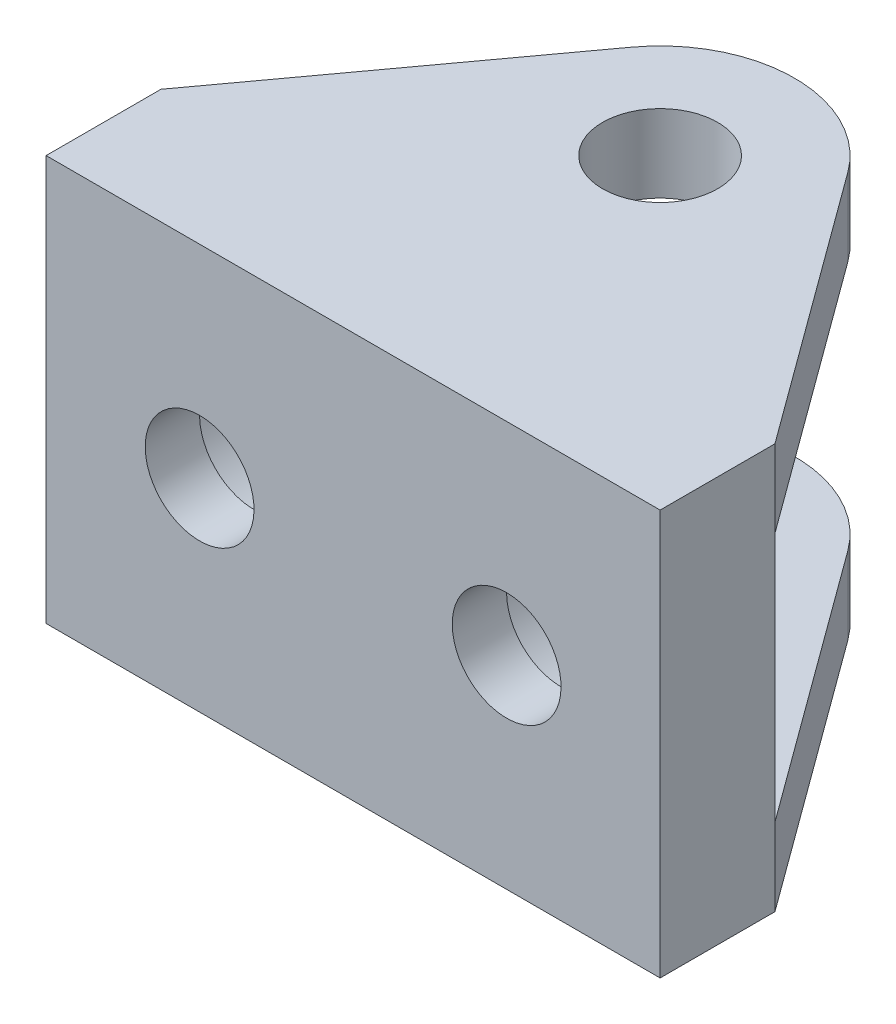
ISO-10303-21;
HEADER;
FILE_DESCRIPTION(('STEP AP214'),'2;1');
FILE_NAME('part.step','',(''),(''),'','','');
FILE_SCHEMA(('AUTOMOTIVE_DESIGN { 1 0 10303 214 1 1 1 1 }'));
ENDSEC;
DATA;
#1=APPLICATION_CONTEXT('core data for automotive mechanical design processes');
#2=APPLICATION_PROTOCOL_DEFINITION('international standard','automotive_design',2000,#1);
#3=PRODUCT_CONTEXT('',#1,'mechanical');
#4=PRODUCT('Part','Part','',(#3));
#5=PRODUCT_RELATED_PRODUCT_CATEGORY('part','',(#4));
#6=PRODUCT_DEFINITION_FORMATION('','',#4);
#7=PRODUCT_DEFINITION_CONTEXT('part definition',#1,'design');
#8=PRODUCT_DEFINITION('design','',#6,#7);
#9=PRODUCT_DEFINITION_SHAPE('','',#8);
#10=(LENGTH_UNIT() NAMED_UNIT(*) SI_UNIT(.MILLI.,.METRE.));
#11=(NAMED_UNIT(*) PLANE_ANGLE_UNIT() SI_UNIT($,.RADIAN.));
#12=(NAMED_UNIT(*) SI_UNIT($,.STERADIAN.) SOLID_ANGLE_UNIT());
#13=UNCERTAINTY_MEASURE_WITH_UNIT(LENGTH_MEASURE(1.E-05),#10,'distance_accuracy_value','');
#14=(GEOMETRIC_REPRESENTATION_CONTEXT(3) GLOBAL_UNCERTAINTY_ASSIGNED_CONTEXT((#13)) GLOBAL_UNIT_ASSIGNED_CONTEXT((#10,
#11,#12)) REPRESENTATION_CONTEXT('',''));
#15=CARTESIAN_POINT('',(0.,0.,0.));
#16=DIRECTION('',(0.,0.,1.));
#17=DIRECTION('',(1.,0.,0.));
#18=AXIS2_PLACEMENT_3D('',#15,#16,#17);
#19=CARTESIAN_POINT('',(50.8,33.528,-9.4996));
#20=DIRECTION('',(-0.807099806213913,0.,0.590415025900819));
#21=DIRECTION('',(0.590415025900819,0.,0.807099806213913));
#22=AXIS2_PLACEMENT_3D('',#19,#20,#21);
#23=PLANE('',#22);
#24=DIRECTION('',(0.,-1.,0.));
#25=VECTOR('',#24,1.);
#26=CARTESIAN_POINT('',(50.8,33.528,-9.4996));
#27=LINE('',#26,#25);
#28=CARTESIAN_POINT('',(50.8,33.528,-9.4996));
#29=VERTEX_POINT('',#28);
#30=CARTESIAN_POINT('',(50.8,27.1145,-9.4996));
#31=VERTEX_POINT('',#30);
#32=EDGE_CURVE('E181',#29,#31,#27,.T.);
#33=ORIENTED_EDGE('',*,*,#32,.T.);
#34=DIRECTION('',(-0.590415025900819,0.,-0.807099806213913));
#35=VECTOR('',#34,1.);
#36=CARTESIAN_POINT('',(50.8,27.1145,-9.4996));
#37=LINE('',#36,#35);
#38=CARTESIAN_POINT('',(34.3688965965521,27.1145,-31.9609869753228));
#39=VERTEX_POINT('',#38);
#40=EDGE_CURVE('E135',#31,#39,#37,.T.);
#41=ORIENTED_EDGE('',*,*,#40,.T.);
#42=DIRECTION('',(0.,-1.,0.));
#43=VECTOR('',#42,1.);
#44=CARTESIAN_POINT('',(34.3688965965521,33.528,-31.9609869753228));
#45=LINE('',#44,#43);
#46=CARTESIAN_POINT('',(34.3688965965521,33.528,-31.9609869753228));
#47=VERTEX_POINT('',#46);
#48=EDGE_CURVE('E133',#47,#39,#45,.T.);
#49=ORIENTED_EDGE('',*,*,#48,.F.);
#50=DIRECTION('',(-0.590415025900819,0.,-0.807099806213913));
#51=VECTOR('',#50,1.);
#52=CARTESIAN_POINT('',(50.8,33.528,-9.4996));
#53=LINE('',#52,#51);
#54=EDGE_CURVE('E117',#29,#47,#53,.T.);
#55=ORIENTED_EDGE('',*,*,#54,.F.);
#56=EDGE_LOOP('',(#33,#41,#49,#55));
#57=FACE_BOUND('',#56,.T.);
#58=ADVANCED_FACE('F45',(#57),#23,.F.);
#59=CARTESIAN_POINT('',(25.4,33.528,-25.4));
#60=DIRECTION('',(0.,-1.,0.));
#61=DIRECTION('',(0.,0.,-1.));
#62=AXIS2_PLACEMENT_3D('',#59,#60,#61);
#63=CYLINDRICAL_SURFACE('',#62,11.1125);
#64=CARTESIAN_POINT('',(25.4,27.1145,-25.4));
#65=DIRECTION('',(0.,1.,0.));
#66=DIRECTION('',(0.,0.,1.));
#67=AXIS2_PLACEMENT_3D('',#64,#65,#66);
#68=CIRCLE('',#67,11.1125);
#69=CARTESIAN_POINT('',(16.4311034034479,27.1145,-31.9609869753228));
#70=VERTEX_POINT('',#69);
#71=EDGE_CURVE('E221',#39,#70,#68,.T.);
#72=ORIENTED_EDGE('',*,*,#71,.T.);
#73=DIRECTION('',(0.,-1.,0.));
#74=VECTOR('',#73,1.);
#75=CARTESIAN_POINT('',(16.4311034034479,33.528,-31.9609869753228));
#76=LINE('',#75,#74);
#77=CARTESIAN_POINT('',(16.4311034034479,33.528,-31.9609869753228));
#78=VERTEX_POINT('',#77);
#79=EDGE_CURVE('E144',#78,#70,#76,.T.);
#80=ORIENTED_EDGE('',*,*,#79,.F.);
#81=CARTESIAN_POINT('',(25.4,33.528,-25.4));
#82=DIRECTION('',(0.,1.,0.));
#83=DIRECTION('',(0.,0.,1.));
#84=AXIS2_PLACEMENT_3D('',#81,#82,#83);
#85=CIRCLE('',#84,11.1125);
#86=EDGE_CURVE('E122',#47,#78,#85,.T.);
#87=ORIENTED_EDGE('',*,*,#86,.F.);
#88=ORIENTED_EDGE('',*,*,#48,.T.);
#89=EDGE_LOOP('',(#72,#80,#87,#88));
#90=FACE_BOUND('',#89,.T.);
#91=ADVANCED_FACE('F142',(#90),#63,.T.);
#92=CARTESIAN_POINT('',(0.,33.528,-9.4996));
#93=DIRECTION('',(0.807099806213913,0.,0.590415025900819));
#94=DIRECTION('',(0.590415025900819,0.,-0.807099806213913));
#95=AXIS2_PLACEMENT_3D('',#92,#93,#94);
#96=PLANE('',#95);
#97=ORIENTED_EDGE('',*,*,#79,.T.);
#98=DIRECTION('',(-0.590415025900819,0.,0.807099806213913));
#99=VECTOR('',#98,1.);
#100=CARTESIAN_POINT('',(0.,27.1145,-9.4996));
#101=LINE('',#100,#99);
#102=CARTESIAN_POINT('',(0.,27.1145,-9.49959999999996));
#103=VERTEX_POINT('',#102);
#104=EDGE_CURVE('E217',#70,#103,#101,.T.);
#105=ORIENTED_EDGE('',*,*,#104,.T.);
#106=DIRECTION('',(0.,-1.,0.));
#107=VECTOR('',#106,1.);
#108=CARTESIAN_POINT('',(0.,33.528,-9.4996));
#109=LINE('',#108,#107);
#110=CARTESIAN_POINT('',(0.,33.528,-9.4996));
#111=VERTEX_POINT('',#110);
#112=EDGE_CURVE('E174',#111,#103,#109,.T.);
#113=ORIENTED_EDGE('',*,*,#112,.F.);
#114=DIRECTION('',(-0.590415025900819,0.,0.807099806213913));
#115=VECTOR('',#114,1.);
#116=CARTESIAN_POINT('',(0.,33.528,-9.4996));
#117=LINE('',#116,#115);
#118=EDGE_CURVE('E72',#78,#111,#117,.T.);
#119=ORIENTED_EDGE('',*,*,#118,.F.);
#120=EDGE_LOOP('',(#97,#105,#113,#119));
#121=FACE_BOUND('',#120,.T.);
#122=ADVANCED_FACE('F247',(#121),#96,.F.);
#123=CARTESIAN_POINT('',(25.4,33.528,-25.4));
#124=DIRECTION('',(0.,-1.,0.));
#125=DIRECTION('',(0.,0.,-1.));
#126=AXIS2_PLACEMENT_3D('',#123,#124,#125);
#127=CYLINDRICAL_SURFACE('',#126,4.7625);
#128=CARTESIAN_POINT('',(25.4,27.1145,-25.4));
#129=DIRECTION('',(0.,1.,0.));
#130=DIRECTION('',(0.,0.,1.));
#131=AXIS2_PLACEMENT_3D('',#128,#129,#130);
#132=CIRCLE('',#131,4.7625);
#133=CARTESIAN_POINT('',(25.4,27.1145,-20.6375));
#134=VERTEX_POINT('',#133);
#135=EDGE_CURVE('E49',#134,#134,#132,.T.);
#136=ORIENTED_EDGE('',*,*,#135,.F.);
#137=EDGE_LOOP('',(#136));
#138=FACE_BOUND('',#137,.T.);
#139=CARTESIAN_POINT('',(25.4,33.528,-25.4));
#140=DIRECTION('',(0.,1.,0.));
#141=DIRECTION('',(0.,0.,1.));
#142=AXIS2_PLACEMENT_3D('',#139,#140,#141);
#143=CIRCLE('',#142,4.7625);
#144=CARTESIAN_POINT('',(25.4,33.528,-20.6375));
#145=VERTEX_POINT('',#144);
#146=EDGE_CURVE('E155',#145,#145,#143,.T.);
#147=ORIENTED_EDGE('',*,*,#146,.T.);
#148=EDGE_LOOP('',(#147));
#149=FACE_BOUND('',#148,.T.);
#150=ADVANCED_FACE('F244',(#138,#149),#127,.F.);
#151=CARTESIAN_POINT('',(25.4,33.528,-25.4));
#152=DIRECTION('',(0.,1.,0.));
#153=DIRECTION('',(0.,0.,1.));
#154=AXIS2_PLACEMENT_3D('',#151,#152,#153);
#155=PLANE('',#154);
#156=DIRECTION('',(0.,0.,1.));
#157=VECTOR('',#156,1.);
#158=CARTESIAN_POINT('',(0.,33.528,0.));
#159=LINE('',#158,#157);
#160=CARTESIAN_POINT('',(0.,33.528,0.));
#161=VERTEX_POINT('',#160);
#162=EDGE_CURVE('E173',#111,#161,#159,.T.);
#163=ORIENTED_EDGE('',*,*,#162,.T.);
#164=DIRECTION('',(1.,0.,0.));
#165=VECTOR('',#164,1.);
#166=CARTESIAN_POINT('',(0.,33.528,0.));
#167=LINE('',#166,#165);
#168=CARTESIAN_POINT('',(50.8,33.528,0.));
#169=VERTEX_POINT('',#168);
#170=EDGE_CURVE('E108',#161,#169,#167,.T.);
#171=ORIENTED_EDGE('',*,*,#170,.T.);
#172=DIRECTION('',(0.,0.,-1.));
#173=VECTOR('',#172,1.);
#174=CARTESIAN_POINT('',(50.8,33.528,0.));
#175=LINE('',#174,#173);
#176=EDGE_CURVE('E125',#169,#29,#175,.T.);
#177=ORIENTED_EDGE('',*,*,#176,.T.);
#178=ORIENTED_EDGE('',*,*,#54,.T.);
#179=ORIENTED_EDGE('',*,*,#86,.T.);
#180=ORIENTED_EDGE('',*,*,#118,.T.);
#181=EDGE_LOOP('',(#163,#171,#177,#178,#179,#180));
#182=FACE_BOUND('',#181,.T.);
#183=ORIENTED_EDGE('',*,*,#146,.F.);
#184=EDGE_LOOP('',(#183));
#185=FACE_BOUND('',#184,.T.);
#186=ADVANCED_FACE('F119',(#182,#185),#155,.T.);
#187=CARTESIAN_POINT('',(25.4,0.,-25.4));
#188=DIRECTION('',(0.,1.,0.));
#189=DIRECTION('',(0.,0.,1.));
#190=AXIS2_PLACEMENT_3D('',#187,#188,#189);
#191=PLANE('',#190);
#192=DIRECTION('',(0.,0.,1.));
#193=VECTOR('',#192,1.);
#194=CARTESIAN_POINT('',(0.,0.,0.));
#195=LINE('',#194,#193);
#196=CARTESIAN_POINT('',(0.,0.,-9.4996));
#197=VERTEX_POINT('',#196);
#198=CARTESIAN_POINT('',(0.,0.,0.));
#199=VERTEX_POINT('',#198);
#200=EDGE_CURVE('E151',#197,#199,#195,.T.);
#201=ORIENTED_EDGE('',*,*,#200,.F.);
#202=DIRECTION('',(-0.590415025900819,0.,0.807099806213913));
#203=VECTOR('',#202,1.);
#204=CARTESIAN_POINT('',(0.,0.,-9.4996));
#205=LINE('',#204,#203);
#206=CARTESIAN_POINT('',(16.4311034034479,0.,-31.9609869753228));
#207=VERTEX_POINT('',#206);
#208=EDGE_CURVE('E170',#207,#197,#205,.T.);
#209=ORIENTED_EDGE('',*,*,#208,.F.);
#210=CARTESIAN_POINT('',(25.4,0.,-25.4));
#211=DIRECTION('',(0.,1.,0.));
#212=DIRECTION('',(0.,0.,1.));
#213=AXIS2_PLACEMENT_3D('',#210,#211,#212);
#214=CIRCLE('',#213,11.1125);
#215=CARTESIAN_POINT('',(34.3688965965521,0.,-31.9609869753228));
#216=VERTEX_POINT('',#215);
#217=EDGE_CURVE('E166',#216,#207,#214,.T.);
#218=ORIENTED_EDGE('',*,*,#217,.F.);
#219=DIRECTION('',(-0.590415025900819,0.,-0.807099806213913));
#220=VECTOR('',#219,1.);
#221=CARTESIAN_POINT('',(50.8,0.,-9.4996));
#222=LINE('',#221,#220);
#223=CARTESIAN_POINT('',(50.8,0.,-9.4996));
#224=VERTEX_POINT('',#223);
#225=EDGE_CURVE('E162',#224,#216,#222,.T.);
#226=ORIENTED_EDGE('',*,*,#225,.F.);
#227=DIRECTION('',(0.,0.,-1.));
#228=VECTOR('',#227,1.);
#229=CARTESIAN_POINT('',(50.8,0.,0.));
#230=LINE('',#229,#228);
#231=CARTESIAN_POINT('',(50.8,0.,0.));
#232=VERTEX_POINT('',#231);
#233=EDGE_CURVE('E158',#232,#224,#230,.T.);
#234=ORIENTED_EDGE('',*,*,#233,.F.);
#235=DIRECTION('',(1.,0.,0.));
#236=VECTOR('',#235,1.);
#237=CARTESIAN_POINT('',(0.,0.,0.));
#238=LINE('',#237,#236);
#239=EDGE_CURVE('E154',#199,#232,#238,.T.);
#240=ORIENTED_EDGE('',*,*,#239,.F.);
#241=EDGE_LOOP('',(#201,#209,#218,#226,#234,#240));
#242=FACE_BOUND('',#241,.T.);
#243=CARTESIAN_POINT('',(25.4,0.,-25.4));
#244=DIRECTION('',(0.,1.,0.));
#245=DIRECTION('',(0.,0.,1.));
#246=AXIS2_PLACEMENT_3D('',#243,#244,#245);
#247=CIRCLE('',#246,4.7625);
#248=CARTESIAN_POINT('',(25.4,0.,-20.6375));
#249=VERTEX_POINT('',#248);
#250=EDGE_CURVE('E226',#249,#249,#247,.T.);
#251=ORIENTED_EDGE('',*,*,#250,.T.);
#252=EDGE_LOOP('',(#251));
#253=FACE_BOUND('',#252,.T.);
#254=ADVANCED_FACE('F252',(#242,#253),#191,.F.);
#255=CARTESIAN_POINT('',(0.,33.528,0.));
#256=DIRECTION('',(1.,0.,0.));
#257=DIRECTION('',(0.,0.,-1.));
#258=AXIS2_PLACEMENT_3D('',#255,#256,#257);
#259=PLANE('',#258);
#260=ORIENTED_EDGE('',*,*,#200,.T.);
#261=DIRECTION('',(0.,-1.,0.));
#262=VECTOR('',#261,1.);
#263=CARTESIAN_POINT('',(0.,33.528,0.));
#264=LINE('',#263,#262);
#265=EDGE_CURVE('E11',#161,#199,#264,.T.);
#266=ORIENTED_EDGE('',*,*,#265,.F.);
#267=ORIENTED_EDGE('',*,*,#162,.F.);
#268=ORIENTED_EDGE('',*,*,#112,.T.);
#269=DIRECTION('',(0.,-1.,0.));
#270=VECTOR('',#269,1.);
#271=CARTESIAN_POINT('',(0.,16.764,-9.49959999999997));
#272=LINE('',#271,#270);
#273=CARTESIAN_POINT('',(0.,6.4135,-9.4996));
#274=VERTEX_POINT('',#273);
#275=EDGE_CURVE('E204',#103,#274,#272,.T.);
#276=ORIENTED_EDGE('',*,*,#275,.T.);
#277=EDGE_CURVE('E100',#274,#197,#109,.T.);
#278=ORIENTED_EDGE('',*,*,#277,.T.);
#279=EDGE_LOOP('',(#260,#266,#267,#268,#276,#278));
#280=FACE_BOUND('',#279,.T.);
#281=ADVANCED_FACE('F47',(#280),#259,.F.);
#282=CARTESIAN_POINT('',(0.,33.528,0.));
#283=DIRECTION('',(0.,0.,-1.));
#284=DIRECTION('',(-1.,0.,0.));
#285=AXIS2_PLACEMENT_3D('',#282,#283,#284);
#286=PLANE('',#285);
#287=CARTESIAN_POINT('',(38.1,16.764,0.));
#288=DIRECTION('',(0.,0.,-1.));
#289=DIRECTION('',(0.,1.,0.));
#290=AXIS2_PLACEMENT_3D('',#287,#288,#289);
#291=CIRCLE('',#290,4.5);
#292=CARTESIAN_POINT('',(38.1,21.264,0.));
#293=VERTEX_POINT('',#292);
#294=EDGE_CURVE('E329',#293,#293,#291,.T.);
#295=ORIENTED_EDGE('',*,*,#294,.T.);
#296=EDGE_LOOP('',(#295));
#297=FACE_BOUND('',#296,.T.);
#298=CARTESIAN_POINT('',(12.7,16.764,0.));
#299=DIRECTION('',(0.,0.,-1.));
#300=DIRECTION('',(0.,1.,0.));
#301=AXIS2_PLACEMENT_3D('',#298,#299,#300);
#302=CIRCLE('',#301,4.5);
#303=CARTESIAN_POINT('',(12.7,21.264,0.));
#304=VERTEX_POINT('',#303);
#305=EDGE_CURVE('E312',#304,#304,#302,.T.);
#306=ORIENTED_EDGE('',*,*,#305,.T.);
#307=EDGE_LOOP('',(#306));
#308=FACE_BOUND('',#307,.T.);
#309=ORIENTED_EDGE('',*,*,#239,.T.);
#310=DIRECTION('',(0.,-1.,0.));
#311=VECTOR('',#310,1.);
#312=CARTESIAN_POINT('',(50.8,33.528,0.));
#313=LINE('',#312,#311);
#314=EDGE_CURVE('E55',#169,#232,#313,.T.);
#315=ORIENTED_EDGE('',*,*,#314,.F.);
#316=ORIENTED_EDGE('',*,*,#170,.F.);
#317=ORIENTED_EDGE('',*,*,#265,.T.);
#318=EDGE_LOOP('',(#309,#315,#316,#317));
#319=FACE_BOUND('',#318,.T.);
#320=ADVANCED_FACE('F277',(#297,#308,#319),#286,.F.);
#321=CARTESIAN_POINT('',(50.8,33.528,0.));
#322=DIRECTION('',(-1.,0.,0.));
#323=DIRECTION('',(0.,0.,1.));
#324=AXIS2_PLACEMENT_3D('',#321,#322,#323);
#325=PLANE('',#324);
#326=ORIENTED_EDGE('',*,*,#233,.T.);
#327=CARTESIAN_POINT('',(50.8,6.4135,-9.4996));
#328=VERTEX_POINT('',#327);
#329=EDGE_CURVE('E139',#328,#224,#27,.T.);
#330=ORIENTED_EDGE('',*,*,#329,.F.);
#331=DIRECTION('',(0.,-1.,0.));
#332=VECTOR('',#331,1.);
#333=CARTESIAN_POINT('',(50.8,16.764,-9.4996));
#334=LINE('',#333,#332);
#335=EDGE_CURVE('E207',#31,#328,#334,.T.);
#336=ORIENTED_EDGE('',*,*,#335,.F.);
#337=ORIENTED_EDGE('',*,*,#32,.F.);
#338=ORIENTED_EDGE('',*,*,#176,.F.);
#339=ORIENTED_EDGE('',*,*,#314,.T.);
#340=EDGE_LOOP('',(#326,#330,#336,#337,#338,#339));
#341=FACE_BOUND('',#340,.T.);
#342=ADVANCED_FACE('F269',(#341),#325,.F.);
#343=CARTESIAN_POINT('',(34.3688965965521,6.4135,-31.9609869753228));
#344=VERTEX_POINT('',#343);
#345=EDGE_CURVE('E140',#344,#216,#45,.T.);
#346=ORIENTED_EDGE('',*,*,#345,.F.);
#347=DIRECTION('',(0.590415025900819,0.,0.807099806213913));
#348=VECTOR('',#347,1.);
#349=CARTESIAN_POINT('',(50.8,6.4135,-9.4996));
#350=LINE('',#349,#348);
#351=EDGE_CURVE('E213',#344,#328,#350,.T.);
#352=ORIENTED_EDGE('',*,*,#351,.T.);
#353=ORIENTED_EDGE('',*,*,#329,.T.);
#354=ORIENTED_EDGE('',*,*,#225,.T.);
#355=EDGE_LOOP('',(#346,#352,#353,#354));
#356=FACE_BOUND('',#355,.T.);
#357=ADVANCED_FACE('F261',(#356),#23,.F.);
#358=CARTESIAN_POINT('',(16.4311034034479,6.4135,-31.9609869753228));
#359=VERTEX_POINT('',#358);
#360=EDGE_CURVE('E178',#359,#207,#76,.T.);
#361=ORIENTED_EDGE('',*,*,#360,.F.);
#362=CARTESIAN_POINT('',(25.4,6.4135,-25.4));
#363=DIRECTION('',(0.,-1.,0.));
#364=DIRECTION('',(0.,0.,-1.));
#365=AXIS2_PLACEMENT_3D('',#362,#363,#364);
#366=CIRCLE('',#365,11.1125);
#367=EDGE_CURVE('E196',#359,#344,#366,.T.);
#368=ORIENTED_EDGE('',*,*,#367,.T.);
#369=ORIENTED_EDGE('',*,*,#345,.T.);
#370=ORIENTED_EDGE('',*,*,#217,.T.);
#371=EDGE_LOOP('',(#361,#368,#369,#370));
#372=FACE_BOUND('',#371,.T.);
#373=ADVANCED_FACE('F266',(#372),#63,.T.);
#374=ORIENTED_EDGE('',*,*,#277,.F.);
#375=DIRECTION('',(0.590415025900819,0.,-0.807099806213913));
#376=VECTOR('',#375,1.);
#377=CARTESIAN_POINT('',(0.,6.4135,-9.4996));
#378=LINE('',#377,#376);
#379=EDGE_CURVE('E189',#274,#359,#378,.T.);
#380=ORIENTED_EDGE('',*,*,#379,.T.);
#381=ORIENTED_EDGE('',*,*,#360,.T.);
#382=ORIENTED_EDGE('',*,*,#208,.T.);
#383=EDGE_LOOP('',(#374,#380,#381,#382));
#384=FACE_BOUND('',#383,.T.);
#385=ADVANCED_FACE('F275',(#384),#96,.F.);
#386=CARTESIAN_POINT('',(25.4,6.4135,-25.4));
#387=DIRECTION('',(0.,-1.,0.));
#388=DIRECTION('',(0.,0.,-1.));
#389=AXIS2_PLACEMENT_3D('',#386,#387,#388);
#390=CIRCLE('',#389,4.7625);
#391=CARTESIAN_POINT('',(25.4,6.4135,-30.1625));
#392=VERTEX_POINT('',#391);
#393=EDGE_CURVE('E186',#392,#392,#390,.T.);
#394=ORIENTED_EDGE('',*,*,#393,.F.);
#395=EDGE_LOOP('',(#394));
#396=FACE_BOUND('',#395,.T.);
#397=ORIENTED_EDGE('',*,*,#250,.F.);
#398=EDGE_LOOP('',(#397));
#399=FACE_BOUND('',#398,.T.);
#400=ADVANCED_FACE('F249',(#396,#399),#127,.F.);
#401=CARTESIAN_POINT('',(0.,27.1145,-9.49959999999996));
#402=DIRECTION('',(0.,1.,0.));
#403=DIRECTION('',(0.,0.,1.));
#404=AXIS2_PLACEMENT_3D('',#401,#402,#403);
#405=PLANE('',#404);
#406=ORIENTED_EDGE('',*,*,#135,.T.);
#407=EDGE_LOOP('',(#406));
#408=FACE_BOUND('',#407,.T.);
#409=DIRECTION('',(1.,0.,0.));
#410=VECTOR('',#409,1.);
#411=CARTESIAN_POINT('',(0.,27.1145,-9.49959999999996));
#412=LINE('',#411,#410);
#413=EDGE_CURVE('E190',#103,#31,#412,.T.);
#414=ORIENTED_EDGE('',*,*,#413,.F.);
#415=ORIENTED_EDGE('',*,*,#104,.F.);
#416=ORIENTED_EDGE('',*,*,#71,.F.);
#417=ORIENTED_EDGE('',*,*,#40,.F.);
#418=EDGE_LOOP('',(#414,#415,#416,#417));
#419=FACE_BOUND('',#418,.T.);
#420=ADVANCED_FACE('F241',(#408,#419),#405,.F.);
#421=CARTESIAN_POINT('',(0.,6.4135,-9.49959999999996));
#422=DIRECTION('',(0.,-1.,0.));
#423=DIRECTION('',(0.,0.,-1.));
#424=AXIS2_PLACEMENT_3D('',#421,#422,#423);
#425=PLANE('',#424);
#426=ORIENTED_EDGE('',*,*,#393,.T.);
#427=EDGE_LOOP('',(#426));
#428=FACE_BOUND('',#427,.T.);
#429=ORIENTED_EDGE('',*,*,#367,.F.);
#430=ORIENTED_EDGE('',*,*,#379,.F.);
#431=DIRECTION('',(1.,0.,0.));
#432=VECTOR('',#431,1.);
#433=CARTESIAN_POINT('',(0.,6.4135,-9.49959999999996));
#434=LINE('',#433,#432);
#435=EDGE_CURVE('E63',#274,#328,#434,.T.);
#436=ORIENTED_EDGE('',*,*,#435,.T.);
#437=ORIENTED_EDGE('',*,*,#351,.F.);
#438=EDGE_LOOP('',(#429,#430,#436,#437));
#439=FACE_BOUND('',#438,.T.);
#440=ADVANCED_FACE('F352',(#428,#439),#425,.F.);
#441=CARTESIAN_POINT('',(0.,16.764,-9.49959999999997));
#442=DIRECTION('',(0.,0.,1.));
#443=DIRECTION('',(1.,0.,0.));
#444=AXIS2_PLACEMENT_3D('',#441,#442,#443);
#445=PLANE('',#444);
#446=CARTESIAN_POINT('',(38.1,16.764,-9.4996));
#447=DIRECTION('',(0.,0.,-1.));
#448=DIRECTION('',(0.,1.,0.));
#449=AXIS2_PLACEMENT_3D('',#446,#447,#448);
#450=CIRCLE('',#449,7.99999999999999);
#451=CARTESIAN_POINT('',(38.1,24.764,-9.4996));
#452=VERTEX_POINT('',#451);
#453=EDGE_CURVE('E341',#452,#452,#450,.T.);
#454=ORIENTED_EDGE('',*,*,#453,.F.);
#455=EDGE_LOOP('',(#454));
#456=FACE_BOUND('',#455,.T.);
#457=CARTESIAN_POINT('',(12.7,16.764,-9.49959999999998));
#458=DIRECTION('',(0.,0.,-1.));
#459=DIRECTION('',(0.,1.,0.));
#460=AXIS2_PLACEMENT_3D('',#457,#458,#459);
#461=CIRCLE('',#460,8.);
#462=CARTESIAN_POINT('',(12.7,24.764,-9.49959999999998));
#463=VERTEX_POINT('',#462);
#464=EDGE_CURVE('E325',#463,#463,#461,.T.);
#465=ORIENTED_EDGE('',*,*,#464,.F.);
#466=EDGE_LOOP('',(#465));
#467=FACE_BOUND('',#466,.T.);
#468=ORIENTED_EDGE('',*,*,#335,.T.);
#469=ORIENTED_EDGE('',*,*,#435,.F.);
#470=ORIENTED_EDGE('',*,*,#275,.F.);
#471=ORIENTED_EDGE('',*,*,#413,.T.);
#472=EDGE_LOOP('',(#468,#469,#470,#471));
#473=FACE_BOUND('',#472,.T.);
#474=ADVANCED_FACE('F348',(#456,#467,#473),#445,.F.);
#475=CARTESIAN_POINT('',(12.7,16.764,-9.49959999999998));
#476=DIRECTION('',(0.,0.,-1.));
#477=DIRECTION('',(0.,1.,0.));
#478=AXIS2_PLACEMENT_3D('',#475,#476,#477);
#479=CYLINDRICAL_SURFACE('',#478,4.5);
#480=ORIENTED_EDGE('',*,*,#305,.F.);
#481=EDGE_LOOP('',(#480));
#482=FACE_BOUND('',#481,.T.);
#483=CARTESIAN_POINT('',(12.7,16.764,-4.49959999999998));
#484=DIRECTION('',(0.,0.,-1.));
#485=DIRECTION('',(0.,1.,0.));
#486=AXIS2_PLACEMENT_3D('',#483,#484,#485);
#487=CIRCLE('',#486,4.5);
#488=CARTESIAN_POINT('',(12.7,21.264,-4.49959999999998));
#489=VERTEX_POINT('',#488);
#490=EDGE_CURVE('E317',#489,#489,#487,.T.);
#491=ORIENTED_EDGE('',*,*,#490,.T.);
#492=EDGE_LOOP('',(#491));
#493=FACE_BOUND('',#492,.T.);
#494=ADVANCED_FACE('F351',(#482,#493),#479,.F.);
#495=CARTESIAN_POINT('',(17.2,16.764,-4.49959999999998));
#496=DIRECTION('',(0.,0.,1.));
#497=DIRECTION('',(0.,-1.,0.));
#498=AXIS2_PLACEMENT_3D('',#495,#496,#497);
#499=PLANE('',#498);
#500=ORIENTED_EDGE('',*,*,#490,.F.);
#501=EDGE_LOOP('',(#500));
#502=FACE_BOUND('',#501,.T.);
#503=CARTESIAN_POINT('',(12.7,16.764,-4.49959999999998));
#504=DIRECTION('',(0.,0.,-1.));
#505=DIRECTION('',(0.,1.,0.));
#506=AXIS2_PLACEMENT_3D('',#503,#504,#505);
#507=CIRCLE('',#506,8.);
#508=CARTESIAN_POINT('',(12.7,24.764,-4.49959999999998));
#509=VERTEX_POINT('',#508);
#510=EDGE_CURVE('E321',#509,#509,#507,.T.);
#511=ORIENTED_EDGE('',*,*,#510,.T.);
#512=EDGE_LOOP('',(#511));
#513=FACE_BOUND('',#512,.T.);
#514=ADVANCED_FACE('F456',(#502,#513),#499,.F.);
#515=CARTESIAN_POINT('',(12.7,16.764,-9.49959999999998));
#516=DIRECTION('',(0.,0.,-1.));
#517=DIRECTION('',(0.,1.,0.));
#518=AXIS2_PLACEMENT_3D('',#515,#516,#517);
#519=CYLINDRICAL_SURFACE('',#518,8.);
#520=ORIENTED_EDGE('',*,*,#510,.F.);
#521=EDGE_LOOP('',(#520));
#522=FACE_BOUND('',#521,.T.);
#523=ORIENTED_EDGE('',*,*,#464,.T.);
#524=EDGE_LOOP('',(#523));
#525=FACE_BOUND('',#524,.T.);
#526=ADVANCED_FACE('F466',(#522,#525),#519,.F.);
#527=CARTESIAN_POINT('',(38.1,16.764,-9.4996));
#528=DIRECTION('',(0.,0.,-1.));
#529=DIRECTION('',(0.,1.,0.));
#530=AXIS2_PLACEMENT_3D('',#527,#528,#529);
#531=CYLINDRICAL_SURFACE('',#530,4.5);
#532=ORIENTED_EDGE('',*,*,#294,.F.);
#533=EDGE_LOOP('',(#532));
#534=FACE_BOUND('',#533,.T.);
#535=CARTESIAN_POINT('',(38.1,16.764,-4.4996));
#536=DIRECTION('',(0.,0.,-1.));
#537=DIRECTION('',(0.,1.,0.));
#538=AXIS2_PLACEMENT_3D('',#535,#536,#537);
#539=CIRCLE('',#538,4.5);
#540=CARTESIAN_POINT('',(38.1,21.264,-4.4996));
#541=VERTEX_POINT('',#540);
#542=EDGE_CURVE('E333',#541,#541,#539,.T.);
#543=ORIENTED_EDGE('',*,*,#542,.T.);
#544=EDGE_LOOP('',(#543));
#545=FACE_BOUND('',#544,.T.);
#546=ADVANCED_FACE('F476',(#534,#545),#531,.F.);
#547=CARTESIAN_POINT('',(42.6,16.764,-4.4996));
#548=DIRECTION('',(0.,0.,1.));
#549=DIRECTION('',(0.,-1.,0.));
#550=AXIS2_PLACEMENT_3D('',#547,#548,#549);
#551=PLANE('',#550);
#552=ORIENTED_EDGE('',*,*,#542,.F.);
#553=EDGE_LOOP('',(#552));
#554=FACE_BOUND('',#553,.T.);
#555=CARTESIAN_POINT('',(38.1,16.764,-4.4996));
#556=DIRECTION('',(0.,0.,-1.));
#557=DIRECTION('',(0.,1.,0.));
#558=AXIS2_PLACEMENT_3D('',#555,#556,#557);
#559=CIRCLE('',#558,8.);
#560=CARTESIAN_POINT('',(38.1,24.764,-4.4996));
#561=VERTEX_POINT('',#560);
#562=EDGE_CURVE('E337',#561,#561,#559,.T.);
#563=ORIENTED_EDGE('',*,*,#562,.T.);
#564=EDGE_LOOP('',(#563));
#565=FACE_BOUND('',#564,.T.);
#566=ADVANCED_FACE('F486',(#554,#565),#551,.F.);
#567=CARTESIAN_POINT('',(38.1,16.764,-9.4996));
#568=DIRECTION('',(0.,0.,-1.));
#569=DIRECTION('',(0.,1.,0.));
#570=AXIS2_PLACEMENT_3D('',#567,#568,#569);
#571=CYLINDRICAL_SURFACE('',#570,8.);
#572=ORIENTED_EDGE('',*,*,#562,.F.);
#573=EDGE_LOOP('',(#572));
#574=FACE_BOUND('',#573,.T.);
#575=ORIENTED_EDGE('',*,*,#453,.T.);
#576=EDGE_LOOP('',(#575));
#577=FACE_BOUND('',#576,.T.);
#578=ADVANCED_FACE('F346',(#574,#577),#571,.F.);
#579=CLOSED_SHELL('',(#58,#91,#122,#150,#186,#254,#281,#320,#342,#357,#373,#385,#400,#420,#440,
#474,#494,#514,#526,#546,#566,#578));
#580=MANIFOLD_SOLID_BREP('B2',#579);
#581=ADVANCED_BREP_SHAPE_REPRESENTATION('',(#18,#580),#14);
#582=SHAPE_DEFINITION_REPRESENTATION(#9,#581);
ENDSEC;
END-ISO-10303-21;
